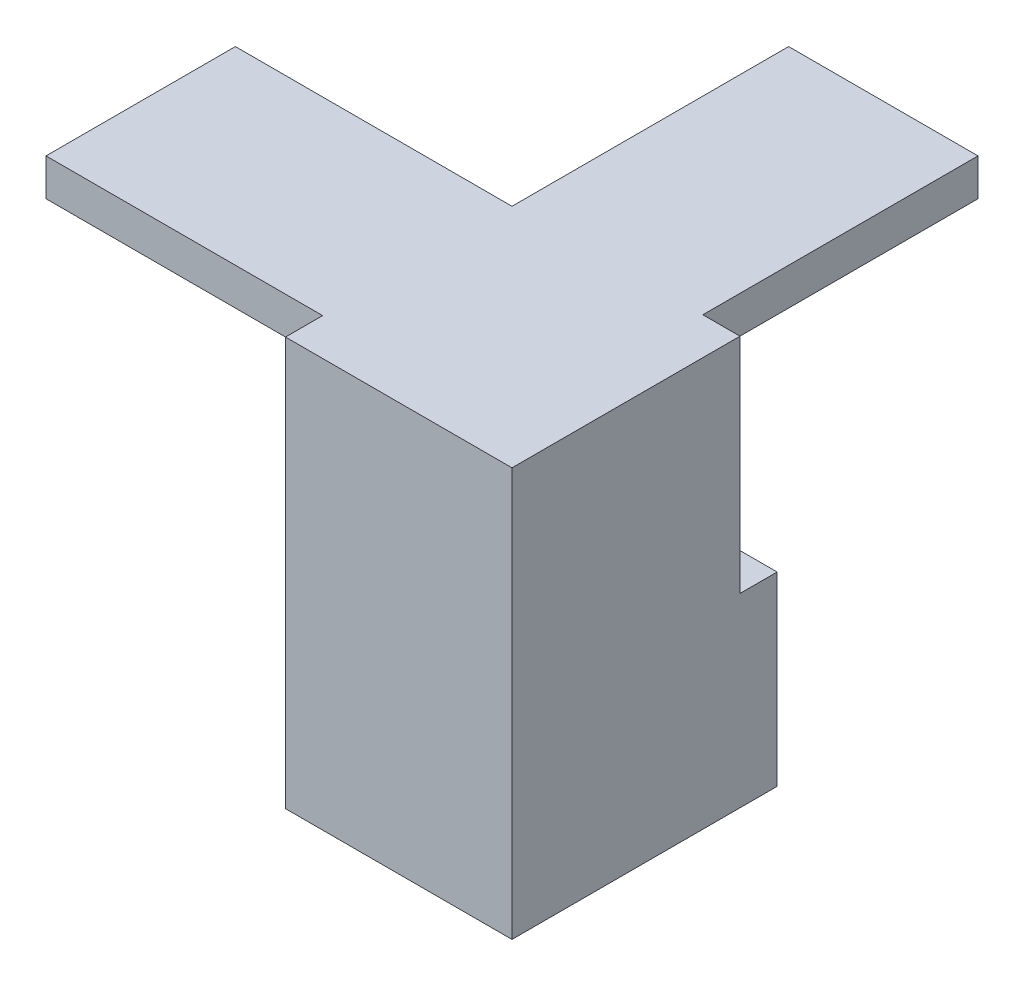
ISO-10303-21;
HEADER;
FILE_DESCRIPTION(('STEP AP214'),'2;1');
FILE_NAME('part.step','',(''),(''),'','','');
FILE_SCHEMA(('AUTOMOTIVE_DESIGN { 1 0 10303 214 1 1 1 1 }'));
ENDSEC;
DATA;
#1=APPLICATION_CONTEXT('core data for automotive mechanical design processes');
#2=APPLICATION_PROTOCOL_DEFINITION('international standard','automotive_design',2000,#1);
#3=PRODUCT_CONTEXT('',#1,'mechanical');
#4=PRODUCT('Part','Part','',(#3));
#5=PRODUCT_RELATED_PRODUCT_CATEGORY('part','',(#4));
#6=PRODUCT_DEFINITION_FORMATION('','',#4);
#7=PRODUCT_DEFINITION_CONTEXT('part definition',#1,'design');
#8=PRODUCT_DEFINITION('design','',#6,#7);
#9=PRODUCT_DEFINITION_SHAPE('','',#8);
#10=(LENGTH_UNIT() NAMED_UNIT(*) SI_UNIT(.MILLI.,.METRE.));
#11=(NAMED_UNIT(*) PLANE_ANGLE_UNIT() SI_UNIT($,.RADIAN.));
#12=(NAMED_UNIT(*) SI_UNIT($,.STERADIAN.) SOLID_ANGLE_UNIT());
#13=UNCERTAINTY_MEASURE_WITH_UNIT(LENGTH_MEASURE(1.E-05),#10,'distance_accuracy_value','');
#14=(GEOMETRIC_REPRESENTATION_CONTEXT(3) GLOBAL_UNCERTAINTY_ASSIGNED_CONTEXT((#13)) GLOBAL_UNIT_ASSIGNED_CONTEXT((#10,
#11,#12)) REPRESENTATION_CONTEXT('',''));
#15=CARTESIAN_POINT('',(0.,0.,0.));
#16=DIRECTION('',(0.,0.,1.));
#17=DIRECTION('',(1.,0.,0.));
#18=AXIS2_PLACEMENT_3D('',#15,#16,#17);
#19=CARTESIAN_POINT('',(17.75,5.,-12.95));
#20=DIRECTION('',(0.,0.,1.));
#21=DIRECTION('',(1.,0.,0.));
#22=AXIS2_PLACEMENT_3D('',#19,#20,#21);
#23=PLANE('',#22);
#24=DIRECTION('',(1.,0.,0.));
#25=VECTOR('',#24,1.);
#26=CARTESIAN_POINT('',(-17.75,-25.,-12.95));
#27=LINE('',#26,#25);
#28=CARTESIAN_POINT('',(12.75,-25.,-12.95));
#29=VERTEX_POINT('',#28);
#30=CARTESIAN_POINT('',(17.75,-25.,-12.95));
#31=VERTEX_POINT('',#30);
#32=EDGE_CURVE('E173',#29,#31,#27,.T.);
#33=ORIENTED_EDGE('',*,*,#32,.F.);
#34=DIRECTION('',(0.,1.,0.));
#35=VECTOR('',#34,1.);
#36=CARTESIAN_POINT('',(12.75,5.,-12.95));
#37=LINE('',#36,#35);
#38=CARTESIAN_POINT('',(12.75,0.,-12.95));
#39=VERTEX_POINT('',#38);
#40=EDGE_CURVE('E44',#29,#39,#37,.T.);
#41=ORIENTED_EDGE('',*,*,#40,.T.);
#42=CARTESIAN_POINT('',(12.75,5.,-12.95));
#43=VERTEX_POINT('',#42);
#44=EDGE_CURVE('E11',#39,#43,#37,.T.);
#45=ORIENTED_EDGE('',*,*,#44,.T.);
#46=DIRECTION('',(-1.,0.,0.));
#47=VECTOR('',#46,1.);
#48=CARTESIAN_POINT('',(17.75,5.,-12.95));
#49=LINE('',#48,#47);
#50=CARTESIAN_POINT('',(17.75,5.,-12.95));
#51=VERTEX_POINT('',#50);
#52=EDGE_CURVE('E193',#51,#43,#49,.T.);
#53=ORIENTED_EDGE('',*,*,#52,.F.);
#54=DIRECTION('',(0.,1.,0.));
#55=VECTOR('',#54,1.);
#56=CARTESIAN_POINT('',(17.75,5.,-12.95));
#57=LINE('',#56,#55);
#58=EDGE_CURVE('E51',#31,#51,#57,.T.);
#59=ORIENTED_EDGE('',*,*,#58,.F.);
#60=EDGE_LOOP('',(#33,#41,#45,#53,#59));
#61=FACE_BOUND('',#60,.T.);
#62=ADVANCED_FACE('F33',(#61),#23,.F.);
#63=CARTESIAN_POINT('',(12.75,5.,12.75));
#64=DIRECTION('',(-1.,0.,0.));
#65=DIRECTION('',(0.,0.,1.));
#66=AXIS2_PLACEMENT_3D('',#63,#64,#65);
#67=PLANE('',#66);
#68=ORIENTED_EDGE('',*,*,#44,.F.);
#69=DIRECTION('',(0.,0.,-1.));
#70=VECTOR('',#69,1.);
#71=CARTESIAN_POINT('',(12.75,0.,12.75));
#72=LINE('',#71,#70);
#73=CARTESIAN_POINT('',(12.75,0.,-50.));
#74=VERTEX_POINT('',#73);
#75=EDGE_CURVE('E243',#39,#74,#72,.T.);
#76=ORIENTED_EDGE('',*,*,#75,.T.);
#77=DIRECTION('',(0.,-1.,0.));
#78=VECTOR('',#77,1.);
#79=CARTESIAN_POINT('',(12.75,5.,-50.));
#80=LINE('',#79,#78);
#81=CARTESIAN_POINT('',(12.75,5.,-50.));
#82=VERTEX_POINT('',#81);
#83=EDGE_CURVE('E255',#82,#74,#80,.T.);
#84=ORIENTED_EDGE('',*,*,#83,.F.);
#85=DIRECTION('',(0.,0.,-1.));
#86=VECTOR('',#85,1.);
#87=CARTESIAN_POINT('',(12.75,5.,12.75));
#88=LINE('',#87,#86);
#89=EDGE_CURVE('E229',#43,#82,#88,.T.);
#90=ORIENTED_EDGE('',*,*,#89,.F.);
#91=EDGE_LOOP('',(#68,#76,#84,#90));
#92=FACE_BOUND('',#91,.T.);
#93=ADVANCED_FACE('F293',(#92),#67,.F.);
#94=CARTESIAN_POINT('',(12.75,5.,12.75));
#95=DIRECTION('',(0.,0.,-1.));
#96=DIRECTION('',(-1.,0.,0.));
#97=AXIS2_PLACEMENT_3D('',#94,#95,#96);
#98=PLANE('',#97);
#99=DIRECTION('',(0.,-1.,0.));
#100=VECTOR('',#99,1.);
#101=CARTESIAN_POINT('',(-12.75,0.,12.75));
#102=LINE('',#101,#100);
#103=CARTESIAN_POINT('',(-12.75,5.,12.75));
#104=VERTEX_POINT('',#103);
#105=CARTESIAN_POINT('',(-12.75,0.,12.75));
#106=VERTEX_POINT('',#105);
#107=EDGE_CURVE('E207',#104,#106,#102,.T.);
#108=ORIENTED_EDGE('',*,*,#107,.F.);
#109=DIRECTION('',(1.,0.,0.));
#110=VECTOR('',#109,1.);
#111=CARTESIAN_POINT('',(12.75,5.,12.75));
#112=LINE('',#111,#110);
#113=CARTESIAN_POINT('',(-50.,5.,12.75));
#114=VERTEX_POINT('',#113);
#115=EDGE_CURVE('E226',#114,#104,#112,.T.);
#116=ORIENTED_EDGE('',*,*,#115,.F.);
#117=DIRECTION('',(0.,-1.,0.));
#118=VECTOR('',#117,1.);
#119=CARTESIAN_POINT('',(-50.,5.,12.75));
#120=LINE('',#119,#118);
#121=CARTESIAN_POINT('',(-50.,0.,12.75));
#122=VERTEX_POINT('',#121);
#123=EDGE_CURVE('E257',#114,#122,#120,.T.);
#124=ORIENTED_EDGE('',*,*,#123,.T.);
#125=DIRECTION('',(1.,0.,0.));
#126=VECTOR('',#125,1.);
#127=CARTESIAN_POINT('',(12.75,0.,12.75));
#128=LINE('',#127,#126);
#129=EDGE_CURVE('E241',#122,#106,#128,.T.);
#130=ORIENTED_EDGE('',*,*,#129,.T.);
#131=EDGE_LOOP('',(#108,#116,#124,#130));
#132=FACE_BOUND('',#131,.T.);
#133=ADVANCED_FACE('F278',(#132),#98,.F.);
#134=CARTESIAN_POINT('',(-12.75,5.,-12.75));
#135=DIRECTION('',(0.,0.,1.));
#136=DIRECTION('',(1.,0.,0.));
#137=AXIS2_PLACEMENT_3D('',#134,#135,#136);
#138=PLANE('',#137);
#139=DIRECTION('',(-1.,0.,0.));
#140=VECTOR('',#139,1.);
#141=CARTESIAN_POINT('',(-12.75,0.,-12.75));
#142=LINE('',#141,#140);
#143=CARTESIAN_POINT('',(-12.75,0.,-12.75));
#144=VERTEX_POINT('',#143);
#145=CARTESIAN_POINT('',(-50.,0.,-12.75));
#146=VERTEX_POINT('',#145);
#147=EDGE_CURVE('E219',#144,#146,#142,.T.);
#148=ORIENTED_EDGE('',*,*,#147,.T.);
#149=DIRECTION('',(0.,-1.,0.));
#150=VECTOR('',#149,1.);
#151=CARTESIAN_POINT('',(-50.,5.,-12.75));
#152=LINE('',#151,#150);
#153=CARTESIAN_POINT('',(-50.,5.,-12.75));
#154=VERTEX_POINT('',#153);
#155=EDGE_CURVE('E37',#154,#146,#152,.T.);
#156=ORIENTED_EDGE('',*,*,#155,.F.);
#157=DIRECTION('',(-1.,0.,0.));
#158=VECTOR('',#157,1.);
#159=CARTESIAN_POINT('',(-12.75,5.,-12.75));
#160=LINE('',#159,#158);
#161=CARTESIAN_POINT('',(-12.75,5.,-12.75));
#162=VERTEX_POINT('',#161);
#163=EDGE_CURVE('E220',#162,#154,#160,.T.);
#164=ORIENTED_EDGE('',*,*,#163,.F.);
#165=DIRECTION('',(0.,-1.,0.));
#166=VECTOR('',#165,1.);
#167=CARTESIAN_POINT('',(-12.75,5.,-12.75));
#168=LINE('',#167,#166);
#169=EDGE_CURVE('E235',#162,#144,#168,.T.);
#170=ORIENTED_EDGE('',*,*,#169,.T.);
#171=EDGE_LOOP('',(#148,#156,#164,#170));
#172=FACE_BOUND('',#171,.T.);
#173=ADVANCED_FACE('F35',(#172),#138,.F.);
#174=CARTESIAN_POINT('',(-50.,5.,-12.75));
#175=DIRECTION('',(1.,0.,0.));
#176=DIRECTION('',(0.,0.,-1.));
#177=AXIS2_PLACEMENT_3D('',#174,#175,#176);
#178=PLANE('',#177);
#179=DIRECTION('',(0.,0.,1.));
#180=VECTOR('',#179,1.);
#181=CARTESIAN_POINT('',(-50.,0.,-12.75));
#182=LINE('',#181,#180);
#183=EDGE_CURVE('E238',#146,#122,#182,.T.);
#184=ORIENTED_EDGE('',*,*,#183,.T.);
#185=ORIENTED_EDGE('',*,*,#123,.F.);
#186=DIRECTION('',(0.,0.,1.));
#187=VECTOR('',#186,1.);
#188=CARTESIAN_POINT('',(-50.,5.,-12.75));
#189=LINE('',#188,#187);
#190=EDGE_CURVE('E223',#154,#114,#189,.T.);
#191=ORIENTED_EDGE('',*,*,#190,.F.);
#192=ORIENTED_EDGE('',*,*,#155,.T.);
#193=EDGE_LOOP('',(#184,#185,#191,#192));
#194=FACE_BOUND('',#193,.T.);
#195=ADVANCED_FACE('F266',(#194),#178,.F.);
#196=CARTESIAN_POINT('',(-12.75,5.,-50.));
#197=DIRECTION('',(0.,0.,1.));
#198=DIRECTION('',(1.,0.,0.));
#199=AXIS2_PLACEMENT_3D('',#196,#197,#198);
#200=PLANE('',#199);
#201=DIRECTION('',(-1.,0.,0.));
#202=VECTOR('',#201,1.);
#203=CARTESIAN_POINT('',(-12.75,0.,-50.));
#204=LINE('',#203,#202);
#205=CARTESIAN_POINT('',(-12.75,0.,-50.));
#206=VERTEX_POINT('',#205);
#207=EDGE_CURVE('E247',#74,#206,#204,.T.);
#208=ORIENTED_EDGE('',*,*,#207,.T.);
#209=DIRECTION('',(0.,-1.,0.));
#210=VECTOR('',#209,1.);
#211=CARTESIAN_POINT('',(-12.75,5.,-50.));
#212=LINE('',#211,#210);
#213=CARTESIAN_POINT('',(-12.75,5.,-50.));
#214=VERTEX_POINT('',#213);
#215=EDGE_CURVE('E252',#214,#206,#212,.T.);
#216=ORIENTED_EDGE('',*,*,#215,.F.);
#217=DIRECTION('',(-1.,0.,0.));
#218=VECTOR('',#217,1.);
#219=CARTESIAN_POINT('',(-12.75,5.,-50.));
#220=LINE('',#219,#218);
#221=EDGE_CURVE('E231',#82,#214,#220,.T.);
#222=ORIENTED_EDGE('',*,*,#221,.F.);
#223=ORIENTED_EDGE('',*,*,#83,.T.);
#224=EDGE_LOOP('',(#208,#216,#222,#223));
#225=FACE_BOUND('',#224,.T.);
#226=ADVANCED_FACE('F296',(#225),#200,.F.);
#227=CARTESIAN_POINT('',(-12.75,5.,-12.75));
#228=DIRECTION('',(1.,0.,0.));
#229=DIRECTION('',(0.,0.,-1.));
#230=AXIS2_PLACEMENT_3D('',#227,#228,#229);
#231=PLANE('',#230);
#232=DIRECTION('',(0.,0.,1.));
#233=VECTOR('',#232,1.);
#234=CARTESIAN_POINT('',(-12.75,0.,-12.75));
#235=LINE('',#234,#233);
#236=EDGE_CURVE('E224',#206,#144,#235,.T.);
#237=ORIENTED_EDGE('',*,*,#236,.T.);
#238=ORIENTED_EDGE('',*,*,#169,.F.);
#239=DIRECTION('',(0.,0.,1.));
#240=VECTOR('',#239,1.);
#241=CARTESIAN_POINT('',(-12.75,5.,-12.75));
#242=LINE('',#241,#240);
#243=EDGE_CURVE('E233',#214,#162,#242,.T.);
#244=ORIENTED_EDGE('',*,*,#243,.F.);
#245=ORIENTED_EDGE('',*,*,#215,.T.);
#246=EDGE_LOOP('',(#237,#238,#244,#245));
#247=FACE_BOUND('',#246,.T.);
#248=ADVANCED_FACE('F299',(#247),#231,.F.);
#249=CARTESIAN_POINT('',(0.,5.,0.));
#250=DIRECTION('',(0.,1.,0.));
#251=DIRECTION('',(0.,0.,1.));
#252=AXIS2_PLACEMENT_3D('',#249,#250,#251);
#253=PLANE('',#252);
#254=ORIENTED_EDGE('',*,*,#163,.T.);
#255=ORIENTED_EDGE('',*,*,#190,.T.);
#256=ORIENTED_EDGE('',*,*,#115,.T.);
#257=DIRECTION('',(0.,0.,-1.));
#258=VECTOR('',#257,1.);
#259=CARTESIAN_POINT('',(-12.75,5.,17.75));
#260=LINE('',#259,#258);
#261=CARTESIAN_POINT('',(-12.75,5.,17.75));
#262=VERTEX_POINT('',#261);
#263=EDGE_CURVE('E216',#262,#104,#260,.T.);
#264=ORIENTED_EDGE('',*,*,#263,.F.);
#265=DIRECTION('',(-1.,0.,0.));
#266=VECTOR('',#265,1.);
#267=CARTESIAN_POINT('',(12.75,5.,17.75));
#268=LINE('',#267,#266);
#269=CARTESIAN_POINT('',(17.75,5.,17.75));
#270=VERTEX_POINT('',#269);
#271=EDGE_CURVE('E199',#270,#262,#268,.T.);
#272=ORIENTED_EDGE('',*,*,#271,.F.);
#273=DIRECTION('',(0.,0.,1.));
#274=VECTOR('',#273,1.);
#275=CARTESIAN_POINT('',(17.75,5.,17.75));
#276=LINE('',#275,#274);
#277=EDGE_CURVE('E191',#51,#270,#276,.T.);
#278=ORIENTED_EDGE('',*,*,#277,.F.);
#279=ORIENTED_EDGE('',*,*,#52,.T.);
#280=ORIENTED_EDGE('',*,*,#89,.T.);
#281=ORIENTED_EDGE('',*,*,#221,.T.);
#282=ORIENTED_EDGE('',*,*,#243,.T.);
#283=EDGE_LOOP('',(#254,#255,#256,#264,#272,#278,#279,#280,#281,#282));
#284=FACE_BOUND('',#283,.T.);
#285=ADVANCED_FACE('F282',(#284),#253,.T.);
#286=CARTESIAN_POINT('',(0.,0.,0.));
#287=DIRECTION('',(0.,1.,0.));
#288=DIRECTION('',(0.,0.,1.));
#289=AXIS2_PLACEMENT_3D('',#286,#287,#288);
#290=PLANE('',#289);
#291=ORIENTED_EDGE('',*,*,#147,.F.);
#292=ORIENTED_EDGE('',*,*,#236,.F.);
#293=ORIENTED_EDGE('',*,*,#207,.F.);
#294=ORIENTED_EDGE('',*,*,#75,.F.);
#295=CARTESIAN_POINT('',(12.75,0.,12.75));
#296=VERTEX_POINT('',#295);
#297=EDGE_CURVE('E244',#296,#39,#72,.T.);
#298=ORIENTED_EDGE('',*,*,#297,.F.);
#299=EDGE_CURVE('E240',#106,#296,#128,.T.);
#300=ORIENTED_EDGE('',*,*,#299,.F.);
#301=ORIENTED_EDGE('',*,*,#129,.F.);
#302=ORIENTED_EDGE('',*,*,#183,.F.);
#303=EDGE_LOOP('',(#291,#292,#293,#294,#298,#300,#301,#302));
#304=FACE_BOUND('',#303,.T.);
#305=ADVANCED_FACE('F273',(#304),#290,.F.);
#306=CARTESIAN_POINT('',(0.,0.,12.75));
#307=DIRECTION('',(0.,0.,1.));
#308=DIRECTION('',(1.,0.,0.));
#309=AXIS2_PLACEMENT_3D('',#306,#307,#308);
#310=PLANE('',#309);
#311=CARTESIAN_POINT('',(-12.75,-50.,12.75));
#312=VERTEX_POINT('',#311);
#313=EDGE_CURVE('E198',#106,#312,#102,.T.);
#314=ORIENTED_EDGE('',*,*,#313,.F.);
#315=ORIENTED_EDGE('',*,*,#299,.T.);
#316=DIRECTION('',(0.,1.,0.));
#317=VECTOR('',#316,1.);
#318=CARTESIAN_POINT('',(12.75,0.,12.75));
#319=LINE('',#318,#317);
#320=CARTESIAN_POINT('',(12.75,-50.,12.75));
#321=VERTEX_POINT('',#320);
#322=EDGE_CURVE('E202',#321,#296,#319,.T.);
#323=ORIENTED_EDGE('',*,*,#322,.F.);
#324=DIRECTION('',(1.,0.,0.));
#325=VECTOR('',#324,1.);
#326=CARTESIAN_POINT('',(-12.75,-50.,12.75));
#327=LINE('',#326,#325);
#328=EDGE_CURVE('E210',#312,#321,#327,.T.);
#329=ORIENTED_EDGE('',*,*,#328,.F.);
#330=EDGE_LOOP('',(#314,#315,#323,#329));
#331=FACE_BOUND('',#330,.T.);
#332=ADVANCED_FACE('F321',(#331),#310,.F.);
#333=CARTESIAN_POINT('',(-12.75,0.,17.75));
#334=DIRECTION('',(1.,0.,0.));
#335=DIRECTION('',(0.,0.,-1.));
#336=AXIS2_PLACEMENT_3D('',#333,#334,#335);
#337=PLANE('',#336);
#338=ORIENTED_EDGE('',*,*,#107,.T.);
#339=ORIENTED_EDGE('',*,*,#313,.T.);
#340=DIRECTION('',(0.,0.,-1.));
#341=VECTOR('',#340,1.);
#342=CARTESIAN_POINT('',(-12.75,-50.,17.75));
#343=LINE('',#342,#341);
#344=CARTESIAN_POINT('',(-12.75,-50.,17.75));
#345=VERTEX_POINT('',#344);
#346=EDGE_CURVE('E206',#345,#312,#343,.T.);
#347=ORIENTED_EDGE('',*,*,#346,.F.);
#348=DIRECTION('',(0.,-1.,0.));
#349=VECTOR('',#348,1.);
#350=CARTESIAN_POINT('',(-12.75,0.,17.75));
#351=LINE('',#350,#349);
#352=EDGE_CURVE('E201',#262,#345,#351,.T.);
#353=ORIENTED_EDGE('',*,*,#352,.F.);
#354=ORIENTED_EDGE('',*,*,#263,.T.);
#355=EDGE_LOOP('',(#338,#339,#347,#353,#354));
#356=FACE_BOUND('',#355,.T.);
#357=ADVANCED_FACE('F284',(#356),#337,.F.);
#358=CARTESIAN_POINT('',(-12.75,-50.,17.75));
#359=DIRECTION('',(0.,1.,0.));
#360=DIRECTION('',(0.,0.,1.));
#361=AXIS2_PLACEMENT_3D('',#358,#359,#360);
#362=PLANE('',#361);
#363=ORIENTED_EDGE('',*,*,#328,.T.);
#364=DIRECTION('',(0.,0.,-1.));
#365=VECTOR('',#364,1.);
#366=CARTESIAN_POINT('',(12.75,-50.,17.75));
#367=LINE('',#366,#365);
#368=CARTESIAN_POINT('',(12.75,-50.,-12.95));
#369=VERTEX_POINT('',#368);
#370=EDGE_CURVE('E188',#321,#369,#367,.T.);
#371=ORIENTED_EDGE('',*,*,#370,.T.);
#372=DIRECTION('',(-1.,0.,0.));
#373=VECTOR('',#372,1.);
#374=CARTESIAN_POINT('',(17.75,-50.,-12.95));
#375=LINE('',#374,#373);
#376=CARTESIAN_POINT('',(-17.75,-50.,-12.95));
#377=VERTEX_POINT('',#376);
#378=EDGE_CURVE('E179',#369,#377,#375,.T.);
#379=ORIENTED_EDGE('',*,*,#378,.T.);
#380=DIRECTION('',(0.,0.,1.));
#381=VECTOR('',#380,1.);
#382=CARTESIAN_POINT('',(-17.75,-50.,-17.95));
#383=LINE('',#382,#381);
#384=CARTESIAN_POINT('',(-17.75,-50.,-17.95));
#385=VERTEX_POINT('',#384);
#386=EDGE_CURVE('E161',#385,#377,#383,.T.);
#387=ORIENTED_EDGE('',*,*,#386,.F.);
#388=DIRECTION('',(-1.,0.,0.));
#389=VECTOR('',#388,1.);
#390=CARTESIAN_POINT('',(17.75,-50.,-17.95));
#391=LINE('',#390,#389);
#392=CARTESIAN_POINT('',(17.75,-50.,-17.95));
#393=VERTEX_POINT('',#392);
#394=EDGE_CURVE('E158',#393,#385,#391,.T.);
#395=ORIENTED_EDGE('',*,*,#394,.F.);
#396=DIRECTION('',(0.,0.,-1.));
#397=VECTOR('',#396,1.);
#398=CARTESIAN_POINT('',(17.75,-50.,17.75));
#399=LINE('',#398,#397);
#400=CARTESIAN_POINT('',(17.75,-50.,17.75));
#401=VERTEX_POINT('',#400);
#402=EDGE_CURVE('E145',#401,#393,#399,.T.);
#403=ORIENTED_EDGE('',*,*,#402,.F.);
#404=DIRECTION('',(1.,0.,0.));
#405=VECTOR('',#404,1.);
#406=CARTESIAN_POINT('',(-12.75,-50.,17.75));
#407=LINE('',#406,#405);
#408=EDGE_CURVE('E204',#345,#401,#407,.T.);
#409=ORIENTED_EDGE('',*,*,#408,.F.);
#410=ORIENTED_EDGE('',*,*,#346,.T.);
#411=EDGE_LOOP('',(#363,#371,#379,#387,#395,#403,#409,#410));
#412=FACE_BOUND('',#411,.T.);
#413=ADVANCED_FACE('F159',(#412),#362,.F.);
#414=CARTESIAN_POINT('',(0.,0.,17.75));
#415=DIRECTION('',(0.,0.,1.));
#416=DIRECTION('',(1.,0.,0.));
#417=AXIS2_PLACEMENT_3D('',#414,#415,#416);
#418=PLANE('',#417);
#419=ORIENTED_EDGE('',*,*,#408,.T.);
#420=DIRECTION('',(0.,-1.,0.));
#421=VECTOR('',#420,1.);
#422=CARTESIAN_POINT('',(17.75,-50.,17.75));
#423=LINE('',#422,#421);
#424=EDGE_CURVE('E153',#270,#401,#423,.T.);
#425=ORIENTED_EDGE('',*,*,#424,.F.);
#426=ORIENTED_EDGE('',*,*,#271,.T.);
#427=ORIENTED_EDGE('',*,*,#352,.T.);
#428=EDGE_LOOP('',(#419,#425,#426,#427));
#429=FACE_BOUND('',#428,.T.);
#430=ADVANCED_FACE('F287',(#429),#418,.T.);
#431=CARTESIAN_POINT('',(17.75,0.,0.));
#432=DIRECTION('',(-1.,0.,0.));
#433=DIRECTION('',(0.,0.,1.));
#434=AXIS2_PLACEMENT_3D('',#431,#432,#433);
#435=PLANE('',#434);
#436=ORIENTED_EDGE('',*,*,#424,.T.);
#437=ORIENTED_EDGE('',*,*,#402,.T.);
#438=DIRECTION('',(0.,-1.,0.));
#439=VECTOR('',#438,1.);
#440=CARTESIAN_POINT('',(17.75,-50.,-17.95));
#441=LINE('',#440,#439);
#442=CARTESIAN_POINT('',(17.75,-25.,-17.95));
#443=VERTEX_POINT('',#442);
#444=EDGE_CURVE('E150',#443,#393,#441,.T.);
#445=ORIENTED_EDGE('',*,*,#444,.F.);
#446=DIRECTION('',(0.,0.,1.));
#447=VECTOR('',#446,1.);
#448=CARTESIAN_POINT('',(17.75,-25.,-17.95));
#449=LINE('',#448,#447);
#450=EDGE_CURVE('E178',#443,#31,#449,.T.);
#451=ORIENTED_EDGE('',*,*,#450,.T.);
#452=ORIENTED_EDGE('',*,*,#58,.T.);
#453=ORIENTED_EDGE('',*,*,#277,.T.);
#454=EDGE_LOOP('',(#436,#437,#445,#451,#452,#453));
#455=FACE_BOUND('',#454,.T.);
#456=ADVANCED_FACE('F147',(#455),#435,.F.);
#457=CARTESIAN_POINT('',(12.75,0.,0.));
#458=DIRECTION('',(-1.,0.,0.));
#459=DIRECTION('',(0.,0.,1.));
#460=AXIS2_PLACEMENT_3D('',#457,#458,#459);
#461=PLANE('',#460);
#462=ORIENTED_EDGE('',*,*,#322,.T.);
#463=ORIENTED_EDGE('',*,*,#297,.T.);
#464=ORIENTED_EDGE('',*,*,#40,.F.);
#465=EDGE_CURVE('E43',#369,#29,#37,.T.);
#466=ORIENTED_EDGE('',*,*,#465,.F.);
#467=ORIENTED_EDGE('',*,*,#370,.F.);
#468=EDGE_LOOP('',(#462,#463,#464,#466,#467));
#469=FACE_BOUND('',#468,.T.);
#470=ADVANCED_FACE('F317',(#469),#461,.T.);
#471=CARTESIAN_POINT('',(-17.75,-50.,-17.95));
#472=DIRECTION('',(1.,0.,0.));
#473=DIRECTION('',(0.,0.,-1.));
#474=AXIS2_PLACEMENT_3D('',#471,#472,#473);
#475=PLANE('',#474);
#476=DIRECTION('',(0.,1.,0.));
#477=VECTOR('',#476,1.);
#478=CARTESIAN_POINT('',(-17.75,-50.,-12.95));
#479=LINE('',#478,#477);
#480=CARTESIAN_POINT('',(-17.75,-25.,-12.95));
#481=VERTEX_POINT('',#480);
#482=EDGE_CURVE('E181',#377,#481,#479,.T.);
#483=ORIENTED_EDGE('',*,*,#482,.T.);
#484=DIRECTION('',(0.,0.,1.));
#485=VECTOR('',#484,1.);
#486=CARTESIAN_POINT('',(-17.75,-25.,-17.95));
#487=LINE('',#486,#485);
#488=CARTESIAN_POINT('',(-17.75,-25.,-17.95));
#489=VERTEX_POINT('',#488);
#490=EDGE_CURVE('E184',#489,#481,#487,.T.);
#491=ORIENTED_EDGE('',*,*,#490,.F.);
#492=DIRECTION('',(0.,1.,0.));
#493=VECTOR('',#492,1.);
#494=CARTESIAN_POINT('',(-17.75,-50.,-17.95));
#495=LINE('',#494,#493);
#496=EDGE_CURVE('E164',#385,#489,#495,.T.);
#497=ORIENTED_EDGE('',*,*,#496,.F.);
#498=ORIENTED_EDGE('',*,*,#386,.T.);
#499=EDGE_LOOP('',(#483,#491,#497,#498));
#500=FACE_BOUND('',#499,.T.);
#501=ADVANCED_FACE('F362',(#500),#475,.F.);
#502=CARTESIAN_POINT('',(-17.75,-25.,-17.95));
#503=DIRECTION('',(0.,-1.,0.));
#504=DIRECTION('',(0.,0.,-1.));
#505=AXIS2_PLACEMENT_3D('',#502,#503,#504);
#506=PLANE('',#505);
#507=EDGE_CURVE('E170',#481,#29,#27,.T.);
#508=ORIENTED_EDGE('',*,*,#507,.T.);
#509=ORIENTED_EDGE('',*,*,#32,.T.);
#510=ORIENTED_EDGE('',*,*,#450,.F.);
#511=DIRECTION('',(1.,0.,0.));
#512=VECTOR('',#511,1.);
#513=CARTESIAN_POINT('',(-17.75,-25.,-17.95));
#514=LINE('',#513,#512);
#515=EDGE_CURVE('E168',#489,#443,#514,.T.);
#516=ORIENTED_EDGE('',*,*,#515,.F.);
#517=ORIENTED_EDGE('',*,*,#490,.T.);
#518=EDGE_LOOP('',(#508,#509,#510,#516,#517));
#519=FACE_BOUND('',#518,.T.);
#520=ADVANCED_FACE('F369',(#519),#506,.F.);
#521=CARTESIAN_POINT('',(0.,0.,-17.95));
#522=DIRECTION('',(0.,0.,-1.));
#523=DIRECTION('',(-1.,0.,0.));
#524=AXIS2_PLACEMENT_3D('',#521,#522,#523);
#525=PLANE('',#524);
#526=ORIENTED_EDGE('',*,*,#444,.T.);
#527=ORIENTED_EDGE('',*,*,#394,.T.);
#528=ORIENTED_EDGE('',*,*,#496,.T.);
#529=ORIENTED_EDGE('',*,*,#515,.T.);
#530=EDGE_LOOP('',(#526,#527,#528,#529));
#531=FACE_BOUND('',#530,.T.);
#532=ADVANCED_FACE('F166',(#531),#525,.T.);
#533=CARTESIAN_POINT('',(0.,0.,-12.95));
#534=DIRECTION('',(0.,0.,-1.));
#535=DIRECTION('',(-1.,0.,0.));
#536=AXIS2_PLACEMENT_3D('',#533,#534,#535);
#537=PLANE('',#536);
#538=ORIENTED_EDGE('',*,*,#465,.T.);
#539=ORIENTED_EDGE('',*,*,#507,.F.);
#540=ORIENTED_EDGE('',*,*,#482,.F.);
#541=ORIENTED_EDGE('',*,*,#378,.F.);
#542=EDGE_LOOP('',(#538,#539,#540,#541));
#543=FACE_BOUND('',#542,.T.);
#544=ADVANCED_FACE('F384',(#543),#537,.F.);
#545=CLOSED_SHELL('',(#62,#93,#133,#173,#195,#226,#248,#285,#305,#332,#357,#413,#430,#456,#470,
#501,#520,#532,#544));
#546=MANIFOLD_SOLID_BREP('B2',#545);
#547=ADVANCED_BREP_SHAPE_REPRESENTATION('',(#18,#546),#14);
#548=SHAPE_DEFINITION_REPRESENTATION(#9,#547);
ENDSEC;
END-ISO-10303-21;
